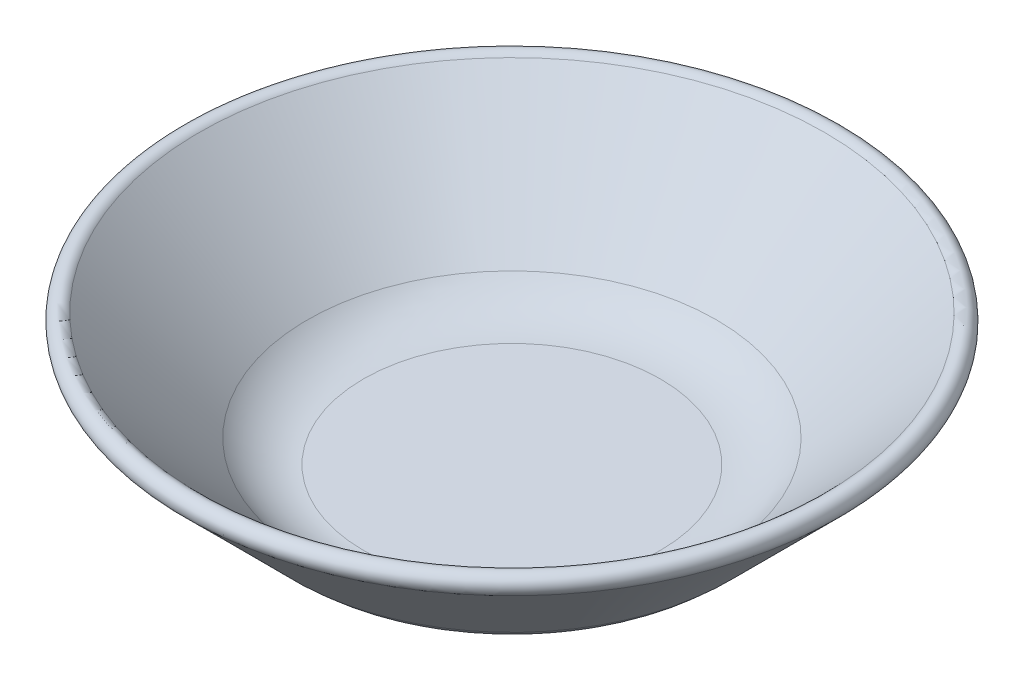
ISO-10303-21;
HEADER;
FILE_DESCRIPTION(('STEP AP214'),'2;1');
FILE_NAME('part.step','',(''),(''),'','','');
FILE_SCHEMA(('AUTOMOTIVE_DESIGN { 1 0 10303 214 1 1 1 1 }'));
ENDSEC;
DATA;
#1=APPLICATION_CONTEXT('core data for automotive mechanical design processes');
#2=APPLICATION_PROTOCOL_DEFINITION('international standard','automotive_design',2000,#1);
#3=PRODUCT_CONTEXT('',#1,'mechanical');
#4=PRODUCT('Part','Part','',(#3));
#5=PRODUCT_RELATED_PRODUCT_CATEGORY('part','',(#4));
#6=PRODUCT_DEFINITION_FORMATION('','',#4);
#7=PRODUCT_DEFINITION_CONTEXT('part definition',#1,'design');
#8=PRODUCT_DEFINITION('design','',#6,#7);
#9=PRODUCT_DEFINITION_SHAPE('','',#8);
#10=(LENGTH_UNIT() NAMED_UNIT(*) SI_UNIT(.MILLI.,.METRE.));
#11=(NAMED_UNIT(*) PLANE_ANGLE_UNIT() SI_UNIT($,.RADIAN.));
#12=(NAMED_UNIT(*) SI_UNIT($,.STERADIAN.) SOLID_ANGLE_UNIT());
#13=UNCERTAINTY_MEASURE_WITH_UNIT(LENGTH_MEASURE(1.E-05),#10,'distance_accuracy_value','');
#14=(GEOMETRIC_REPRESENTATION_CONTEXT(3) GLOBAL_UNCERTAINTY_ASSIGNED_CONTEXT((#13)) GLOBAL_UNIT_ASSIGNED_CONTEXT((#10,
#11,#12)) REPRESENTATION_CONTEXT('',''));
#15=CARTESIAN_POINT('',(0.,0.,0.));
#16=DIRECTION('',(0.,0.,1.));
#17=DIRECTION('',(1.,0.,0.));
#18=AXIS2_PLACEMENT_3D('',#15,#16,#17);
#19=CARTESIAN_POINT('',(0.,0.,0.));
#20=DIRECTION('',(0.,-1.,0.));
#21=DIRECTION('',(0.,0.,-1.));
#22=AXIS2_PLACEMENT_3D('',#19,#20,#21);
#23=PLANE('',#22);
#24=CARTESIAN_POINT('',(0.,0.,0.));
#25=DIRECTION('',(0.,-1.,0.));
#26=DIRECTION('',(0.,0.,-1.));
#27=AXIS2_PLACEMENT_3D('',#24,#25,#26);
#28=CIRCLE('',#27,37.5);
#29=CARTESIAN_POINT('',(0.,0.,-37.5));
#30=VERTEX_POINT('',#29);
#31=EDGE_CURVE('E10',#30,#30,#28,.T.);
#32=ORIENTED_EDGE('',*,*,#31,.T.);
#33=EDGE_LOOP('',(#32));
#34=FACE_BOUND('',#33,.T.);
#35=ADVANCED_FACE('F39',(#34),#23,.T.);
#36=CARTESIAN_POINT('',(0.,25.,0.));
#37=DIRECTION('',(0.,-1.,0.));
#38=DIRECTION('',(0.,0.,-1.));
#39=AXIS2_PLACEMENT_3D('',#36,#37,#38);
#40=TOROIDAL_SURFACE('',#39,37.5,25.);
#41=CARTESIAN_POINT('',(0.,7.32233047033634,0.));
#42=DIRECTION('',(0.,-1.,0.));
#43=DIRECTION('',(0.,0.,-1.));
#44=AXIS2_PLACEMENT_3D('',#41,#42,#43);
#45=CIRCLE('',#44,55.1776695296637);
#46=CARTESIAN_POINT('',(0.,7.32233047033634,-55.1776695296637));
#47=VERTEX_POINT('',#46);
#48=EDGE_CURVE('E44',#47,#47,#45,.T.);
#49=ORIENTED_EDGE('',*,*,#48,.T.);
#50=EDGE_LOOP('',(#49));
#51=FACE_BOUND('',#50,.T.);
#52=ORIENTED_EDGE('',*,*,#31,.F.);
#53=EDGE_LOOP('',(#52));
#54=FACE_BOUND('',#53,.T.);
#55=ADVANCED_FACE('F77',(#51,#54),#40,.T.);
#56=CARTESIAN_POINT('',(0.,7.32233047033634,0.));
#57=DIRECTION('',(0.,1.,0.));
#58=DIRECTION('',(0.,0.,1.));
#59=AXIS2_PLACEMENT_3D('',#56,#57,#58);
#60=CONICAL_SURFACE('',#59,55.1776695296637,0.785398163397446);
#61=CARTESIAN_POINT('',(0.,34.6446609406727,0.));
#62=DIRECTION('',(0.,-1.,0.));
#63=DIRECTION('',(0.,0.,-1.));
#64=AXIS2_PLACEMENT_3D('',#61,#62,#63);
#65=CIRCLE('',#64,82.5);
#66=CARTESIAN_POINT('',(0.,34.6446609406727,-82.5));
#67=VERTEX_POINT('',#66);
#68=EDGE_CURVE('E47',#67,#67,#65,.T.);
#69=ORIENTED_EDGE('',*,*,#68,.T.);
#70=EDGE_LOOP('',(#69));
#71=FACE_BOUND('',#70,.T.);
#72=ORIENTED_EDGE('',*,*,#48,.F.);
#73=EDGE_LOOP('',(#72));
#74=FACE_BOUND('',#73,.T.);
#75=ADVANCED_FACE('F83',(#71,#74),#60,.T.);
#76=CARTESIAN_POINT('',(0.,36.4124278936391,0.));
#77=DIRECTION('',(0.,-1.,0.));
#78=DIRECTION('',(0.,0.,-1.));
#79=AXIS2_PLACEMENT_3D('',#76,#77,#78);
#80=TOROIDAL_SURFACE('',#79,80.7322330470336,2.5);
#81=CARTESIAN_POINT('',(0.,38.1801948466055,0.));
#82=DIRECTION('',(0.,-1.,0.));
#83=DIRECTION('',(0.,0.,-1.));
#84=AXIS2_PLACEMENT_3D('',#81,#82,#83);
#85=CIRCLE('',#84,78.9644660940673);
#86=CARTESIAN_POINT('',(0.,38.1801948466055,-78.9644660940673));
#87=VERTEX_POINT('',#86);
#88=EDGE_CURVE('E52',#87,#87,#85,.T.);
#89=ORIENTED_EDGE('',*,*,#88,.T.);
#90=EDGE_LOOP('',(#89));
#91=FACE_BOUND('',#90,.T.);
#92=ORIENTED_EDGE('',*,*,#68,.F.);
#93=EDGE_LOOP('',(#92));
#94=FACE_BOUND('',#93,.T.);
#95=ADVANCED_FACE('F82',(#91,#94),#80,.T.);
#96=CARTESIAN_POINT('',(0.,38.1801948466055,0.));
#97=DIRECTION('',(0.,1.,0.));
#98=DIRECTION('',(0.,0.,1.));
#99=AXIS2_PLACEMENT_3D('',#96,#97,#98);
#100=CONICAL_SURFACE('',#99,78.9644660940673,0.785398163397447);
#101=CARTESIAN_POINT('',(0.,10.8578643762691,0.));
#102=DIRECTION('',(0.,-1.,0.));
#103=DIRECTION('',(0.,0.,-1.));
#104=AXIS2_PLACEMENT_3D('',#101,#102,#103);
#105=CIRCLE('',#104,51.642135623731);
#106=CARTESIAN_POINT('',(0.,10.8578643762691,-51.642135623731));
#107=VERTEX_POINT('',#106);
#108=EDGE_CURVE('E59',#107,#107,#105,.T.);
#109=ORIENTED_EDGE('',*,*,#108,.T.);
#110=EDGE_LOOP('',(#109));
#111=FACE_BOUND('',#110,.T.);
#112=ORIENTED_EDGE('',*,*,#88,.F.);
#113=EDGE_LOOP('',(#112));
#114=FACE_BOUND('',#113,.T.);
#115=ADVANCED_FACE('F71',(#111,#114),#100,.F.);
#116=CARTESIAN_POINT('',(0.,25.,0.));
#117=DIRECTION('',(0.,-1.,0.));
#118=DIRECTION('',(0.,0.,-1.));
#119=AXIS2_PLACEMENT_3D('',#116,#117,#118);
#120=TOROIDAL_SURFACE('',#119,37.5,20.);
#121=CARTESIAN_POINT('',(0.,5.,0.));
#122=DIRECTION('',(0.,-1.,0.));
#123=DIRECTION('',(0.,0.,-1.));
#124=AXIS2_PLACEMENT_3D('',#121,#122,#123);
#125=CIRCLE('',#124,37.5);
#126=CARTESIAN_POINT('',(0.,5.,-37.5));
#127=VERTEX_POINT('',#126);
#128=EDGE_CURVE('E62',#127,#127,#125,.T.);
#129=ORIENTED_EDGE('',*,*,#128,.T.);
#130=EDGE_LOOP('',(#129));
#131=FACE_BOUND('',#130,.T.);
#132=ORIENTED_EDGE('',*,*,#108,.F.);
#133=EDGE_LOOP('',(#132));
#134=FACE_BOUND('',#133,.T.);
#135=ADVANCED_FACE('F63',(#131,#134),#120,.F.);
#136=CARTESIAN_POINT('',(0.,5.,0.));
#137=DIRECTION('',(0.,1.,0.));
#138=DIRECTION('',(0.,0.,1.));
#139=AXIS2_PLACEMENT_3D('',#136,#137,#138);
#140=PLANE('',#139);
#141=ORIENTED_EDGE('',*,*,#128,.F.);
#142=EDGE_LOOP('',(#141));
#143=FACE_BOUND('',#142,.T.);
#144=ADVANCED_FACE('F66',(#143),#140,.T.);
#145=CLOSED_SHELL('',(#35,#55,#75,#95,#115,#135,#144));
#146=MANIFOLD_SOLID_BREP('B2',#145);
#147=ADVANCED_BREP_SHAPE_REPRESENTATION('',(#18,#146),#14);
#148=SHAPE_DEFINITION_REPRESENTATION(#9,#147);
ENDSEC;
END-ISO-10303-21;
